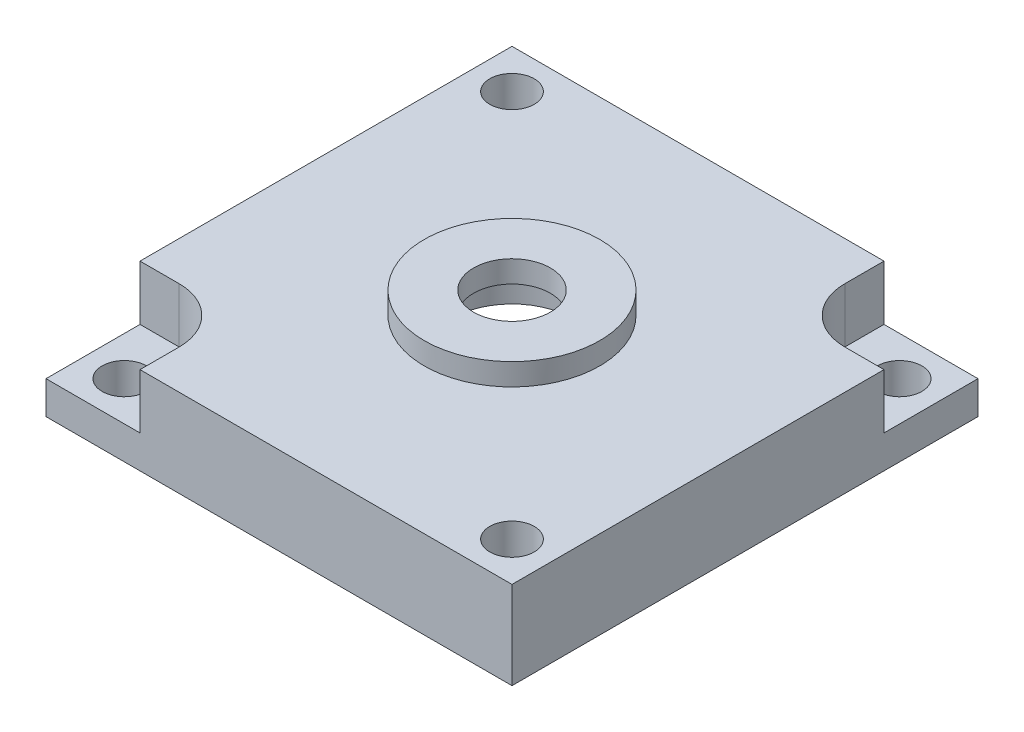
ISO-10303-21;
HEADER;
FILE_DESCRIPTION(('STEP AP214'),'2;1');
FILE_NAME('part.step','',(''),(''),'','','');
FILE_SCHEMA(('AUTOMOTIVE_DESIGN { 1 0 10303 214 1 1 1 1 }'));
ENDSEC;
DATA;
#1=APPLICATION_CONTEXT('core data for automotive mechanical design processes');
#2=APPLICATION_PROTOCOL_DEFINITION('international standard','automotive_design',2000,#1);
#3=PRODUCT_CONTEXT('',#1,'mechanical');
#4=PRODUCT('Part','Part','',(#3));
#5=PRODUCT_RELATED_PRODUCT_CATEGORY('part','',(#4));
#6=PRODUCT_DEFINITION_FORMATION('','',#4);
#7=PRODUCT_DEFINITION_CONTEXT('part definition',#1,'design');
#8=PRODUCT_DEFINITION('design','',#6,#7);
#9=PRODUCT_DEFINITION_SHAPE('','',#8);
#10=(LENGTH_UNIT() NAMED_UNIT(*) SI_UNIT(.MILLI.,.METRE.));
#11=(NAMED_UNIT(*) PLANE_ANGLE_UNIT() SI_UNIT($,.RADIAN.));
#12=(NAMED_UNIT(*) SI_UNIT($,.STERADIAN.) SOLID_ANGLE_UNIT());
#13=UNCERTAINTY_MEASURE_WITH_UNIT(LENGTH_MEASURE(1.E-05),#10,'distance_accuracy_value','');
#14=(GEOMETRIC_REPRESENTATION_CONTEXT(3) GLOBAL_UNCERTAINTY_ASSIGNED_CONTEXT((#13)) GLOBAL_UNIT_ASSIGNED_CONTEXT((#10,
#11,#12)) REPRESENTATION_CONTEXT('',''));
#15=CARTESIAN_POINT('',(0.,0.,0.));
#16=DIRECTION('',(0.,0.,1.));
#17=DIRECTION('',(1.,0.,0.));
#18=AXIS2_PLACEMENT_3D('',#15,#16,#17);
#19=CARTESIAN_POINT('',(17.6776695296637,5.,-17.6776695296637));
#20=DIRECTION('',(0.,-1.,0.));
#21=DIRECTION('',(0.,0.,-1.));
#22=AXIS2_PLACEMENT_3D('',#19,#20,#21);
#23=CYLINDRICAL_SURFACE('',#22,2.025);
#24=CARTESIAN_POINT('',(17.6776695296637,0.,-17.6776695296637));
#25=DIRECTION('',(0.,1.,0.));
#26=DIRECTION('',(0.,0.,1.));
#27=AXIS2_PLACEMENT_3D('',#24,#25,#26);
#28=CIRCLE('',#27,2.025);
#29=CARTESIAN_POINT('',(17.6776695296637,0.,-15.6526695296637));
#30=VERTEX_POINT('',#29);
#31=EDGE_CURVE('E346',#30,#30,#28,.T.);
#32=ORIENTED_EDGE('',*,*,#31,.F.);
#33=EDGE_LOOP('',(#32));
#34=FACE_BOUND('',#33,.T.);
#35=CARTESIAN_POINT('',(17.6776695296637,3.,-17.6776695296637));
#36=DIRECTION('',(0.,1.,0.));
#37=DIRECTION('',(0.,0.,1.));
#38=AXIS2_PLACEMENT_3D('',#35,#36,#37);
#39=CIRCLE('',#38,2.025);
#40=CARTESIAN_POINT('',(17.6776695296637,3.,-15.6526695296637));
#41=VERTEX_POINT('',#40);
#42=EDGE_CURVE('E307',#41,#41,#39,.T.);
#43=ORIENTED_EDGE('',*,*,#42,.T.);
#44=EDGE_LOOP('',(#43));
#45=FACE_BOUND('',#44,.T.);
#46=ADVANCED_FACE('F122',(#34,#45),#23,.F.);
#47=CARTESIAN_POINT('',(-17.6776695296637,5.,17.6776695296637));
#48=DIRECTION('',(0.,-1.,0.));
#49=DIRECTION('',(0.,0.,-1.));
#50=AXIS2_PLACEMENT_3D('',#47,#48,#49);
#51=CYLINDRICAL_SURFACE('',#50,2.025);
#52=CARTESIAN_POINT('',(-17.6776695296637,0.,17.6776695296637));
#53=DIRECTION('',(0.,1.,0.));
#54=DIRECTION('',(0.,0.,1.));
#55=AXIS2_PLACEMENT_3D('',#52,#53,#54);
#56=CIRCLE('',#55,2.025);
#57=CARTESIAN_POINT('',(-17.6776695296637,0.,19.7026695296637));
#58=VERTEX_POINT('',#57);
#59=EDGE_CURVE('E338',#58,#58,#56,.T.);
#60=ORIENTED_EDGE('',*,*,#59,.F.);
#61=EDGE_LOOP('',(#60));
#62=FACE_BOUND('',#61,.T.);
#63=CARTESIAN_POINT('',(-17.6776695296637,3.,17.6776695296637));
#64=DIRECTION('',(0.,1.,0.));
#65=DIRECTION('',(0.,0.,1.));
#66=AXIS2_PLACEMENT_3D('',#63,#64,#65);
#67=CIRCLE('',#66,2.025);
#68=CARTESIAN_POINT('',(-17.6776695296637,3.,19.7026695296637));
#69=VERTEX_POINT('',#68);
#70=EDGE_CURVE('E258',#69,#69,#67,.T.);
#71=ORIENTED_EDGE('',*,*,#70,.T.);
#72=EDGE_LOOP('',(#71));
#73=FACE_BOUND('',#72,.T.);
#74=ADVANCED_FACE('F124',(#62,#73),#51,.F.);
#75=CARTESIAN_POINT('',(0.,5.,21.25));
#76=DIRECTION('',(0.,0.,-1.));
#77=DIRECTION('',(-1.,0.,0.));
#78=AXIS2_PLACEMENT_3D('',#75,#76,#77);
#79=PLANE('',#78);
#80=DIRECTION('',(-1.,0.,0.));
#81=VECTOR('',#80,1.);
#82=CARTESIAN_POINT('',(0.,8.,21.25));
#83=LINE('',#82,#81);
#84=CARTESIAN_POINT('',(21.25,8.,21.25));
#85=VERTEX_POINT('',#84);
#86=CARTESIAN_POINT('',(-12.6776695296637,8.,21.25));
#87=VERTEX_POINT('',#86);
#88=EDGE_CURVE('E324',#85,#87,#83,.T.);
#89=ORIENTED_EDGE('',*,*,#88,.T.);
#90=DIRECTION('',(0.,1.,0.));
#91=VECTOR('',#90,1.);
#92=CARTESIAN_POINT('',(-12.6776695296637,3.,21.25));
#93=LINE('',#92,#91);
#94=CARTESIAN_POINT('',(-12.6776695296637,3.,21.25));
#95=VERTEX_POINT('',#94);
#96=EDGE_CURVE('E259',#95,#87,#93,.T.);
#97=ORIENTED_EDGE('',*,*,#96,.F.);
#98=DIRECTION('',(1.,0.,0.));
#99=VECTOR('',#98,1.);
#100=CARTESIAN_POINT('',(-21.25,3.,21.25));
#101=LINE('',#100,#99);
#102=CARTESIAN_POINT('',(-21.25,3.,21.25));
#103=VERTEX_POINT('',#102);
#104=EDGE_CURVE('E246',#103,#95,#101,.T.);
#105=ORIENTED_EDGE('',*,*,#104,.F.);
#106=DIRECTION('',(0.,-1.,0.));
#107=VECTOR('',#106,1.);
#108=CARTESIAN_POINT('',(-21.25,5.,21.25));
#109=LINE('',#108,#107);
#110=CARTESIAN_POINT('',(-21.25,0.,21.25));
#111=VERTEX_POINT('',#110);
#112=EDGE_CURVE('E374',#103,#111,#109,.T.);
#113=ORIENTED_EDGE('',*,*,#112,.T.);
#114=DIRECTION('',(1.,0.,0.));
#115=VECTOR('',#114,1.);
#116=CARTESIAN_POINT('',(0.,0.,21.25));
#117=LINE('',#116,#115);
#118=CARTESIAN_POINT('',(21.25,0.,21.25));
#119=VERTEX_POINT('',#118);
#120=EDGE_CURVE('E358',#111,#119,#117,.T.);
#121=ORIENTED_EDGE('',*,*,#120,.T.);
#122=DIRECTION('',(0.,-1.,0.));
#123=VECTOR('',#122,1.);
#124=CARTESIAN_POINT('',(21.25,5.,21.25));
#125=LINE('',#124,#123);
#126=EDGE_CURVE('E131',#85,#119,#125,.T.);
#127=ORIENTED_EDGE('',*,*,#126,.F.);
#128=EDGE_LOOP('',(#89,#97,#105,#113,#121,#127));
#129=FACE_BOUND('',#128,.T.);
#130=ADVANCED_FACE('F414',(#129),#79,.F.);
#131=CARTESIAN_POINT('',(21.25,5.,0.));
#132=DIRECTION('',(-1.,0.,0.));
#133=DIRECTION('',(0.,0.,1.));
#134=AXIS2_PLACEMENT_3D('',#131,#132,#133);
#135=PLANE('',#134);
#136=DIRECTION('',(0.,0.,-1.));
#137=VECTOR('',#136,1.);
#138=CARTESIAN_POINT('',(21.25,3.,-12.6776695296637));
#139=LINE('',#138,#137);
#140=CARTESIAN_POINT('',(21.25,3.,-12.6776695296637));
#141=VERTEX_POINT('',#140);
#142=CARTESIAN_POINT('',(21.25,3.,-21.25));
#143=VERTEX_POINT('',#142);
#144=EDGE_CURVE('E294',#141,#143,#139,.T.);
#145=ORIENTED_EDGE('',*,*,#144,.F.);
#146=DIRECTION('',(0.,1.,0.));
#147=VECTOR('',#146,1.);
#148=CARTESIAN_POINT('',(21.25,3.,-12.6776695296637));
#149=LINE('',#148,#147);
#150=CARTESIAN_POINT('',(21.25,8.,-12.6776695296637));
#151=VERTEX_POINT('',#150);
#152=EDGE_CURVE('E268',#141,#151,#149,.T.);
#153=ORIENTED_EDGE('',*,*,#152,.T.);
#154=DIRECTION('',(0.,0.,1.));
#155=VECTOR('',#154,1.);
#156=CARTESIAN_POINT('',(21.25,8.,0.));
#157=LINE('',#156,#155);
#158=EDGE_CURVE('E328',#151,#85,#157,.T.);
#159=ORIENTED_EDGE('',*,*,#158,.T.);
#160=ORIENTED_EDGE('',*,*,#126,.T.);
#161=DIRECTION('',(0.,0.,-1.));
#162=VECTOR('',#161,1.);
#163=CARTESIAN_POINT('',(21.25,0.,0.));
#164=LINE('',#163,#162);
#165=CARTESIAN_POINT('',(21.25,0.,-21.25));
#166=VERTEX_POINT('',#165);
#167=EDGE_CURVE('E362',#119,#166,#164,.T.);
#168=ORIENTED_EDGE('',*,*,#167,.T.);
#169=DIRECTION('',(0.,-1.,0.));
#170=VECTOR('',#169,1.);
#171=CARTESIAN_POINT('',(21.25,5.,-21.25));
#172=LINE('',#171,#170);
#173=EDGE_CURVE('E380',#143,#166,#172,.T.);
#174=ORIENTED_EDGE('',*,*,#173,.F.);
#175=EDGE_LOOP('',(#145,#153,#159,#160,#168,#174));
#176=FACE_BOUND('',#175,.T.);
#177=ADVANCED_FACE('F404',(#176),#135,.F.);
#178=CARTESIAN_POINT('',(0.,5.,-21.25));
#179=DIRECTION('',(0.,0.,-1.));
#180=DIRECTION('',(-1.,0.,0.));
#181=AXIS2_PLACEMENT_3D('',#178,#179,#180);
#182=PLANE('',#181);
#183=DIRECTION('',(0.,1.,0.));
#184=VECTOR('',#183,1.);
#185=CARTESIAN_POINT('',(12.6776695296637,3.,-21.25));
#186=LINE('',#185,#184);
#187=CARTESIAN_POINT('',(12.6776695296637,3.,-21.25));
#188=VERTEX_POINT('',#187);
#189=CARTESIAN_POINT('',(12.6776695296637,8.,-21.25));
#190=VERTEX_POINT('',#189);
#191=EDGE_CURVE('E272',#188,#190,#186,.T.);
#192=ORIENTED_EDGE('',*,*,#191,.F.);
#193=DIRECTION('',(-1.,0.,0.));
#194=VECTOR('',#193,1.);
#195=CARTESIAN_POINT('',(21.25,3.,-21.25));
#196=LINE('',#195,#194);
#197=EDGE_CURVE('E291',#143,#188,#196,.T.);
#198=ORIENTED_EDGE('',*,*,#197,.F.);
#199=ORIENTED_EDGE('',*,*,#173,.T.);
#200=DIRECTION('',(1.,0.,0.));
#201=VECTOR('',#200,1.);
#202=CARTESIAN_POINT('',(0.,0.,-21.25));
#203=LINE('',#202,#201);
#204=CARTESIAN_POINT('',(-21.25,0.,-21.25));
#205=VERTEX_POINT('',#204);
#206=EDGE_CURVE('E366',#205,#166,#203,.T.);
#207=ORIENTED_EDGE('',*,*,#206,.F.);
#208=DIRECTION('',(0.,-1.,0.));
#209=VECTOR('',#208,1.);
#210=CARTESIAN_POINT('',(-21.25,5.,-21.25));
#211=LINE('',#210,#209);
#212=CARTESIAN_POINT('',(-21.25,8.,-21.25));
#213=VERTEX_POINT('',#212);
#214=EDGE_CURVE('E377',#213,#205,#211,.T.);
#215=ORIENTED_EDGE('',*,*,#214,.F.);
#216=DIRECTION('',(-1.,0.,0.));
#217=VECTOR('',#216,1.);
#218=CARTESIAN_POINT('',(0.,8.,-21.25));
#219=LINE('',#218,#217);
#220=EDGE_CURVE('E331',#190,#213,#219,.T.);
#221=ORIENTED_EDGE('',*,*,#220,.F.);
#222=EDGE_LOOP('',(#192,#198,#199,#207,#215,#221));
#223=FACE_BOUND('',#222,.T.);
#224=ADVANCED_FACE('F424',(#223),#182,.T.);
#225=CARTESIAN_POINT('',(0.,5.,0.));
#226=DIRECTION('',(0.,-1.,0.));
#227=DIRECTION('',(0.,0.,-1.));
#228=AXIS2_PLACEMENT_3D('',#225,#226,#227);
#229=CYLINDRICAL_SURFACE('',#228,18.5);
#230=CARTESIAN_POINT('',(0.,5.,0.));
#231=DIRECTION('',(0.,1.,0.));
#232=DIRECTION('',(0.,0.,1.));
#233=AXIS2_PLACEMENT_3D('',#230,#231,#232);
#234=CIRCLE('',#233,18.5);
#235=CARTESIAN_POINT('',(0.,5.,18.5));
#236=VERTEX_POINT('',#235);
#237=EDGE_CURVE('E334',#236,#236,#234,.T.);
#238=ORIENTED_EDGE('',*,*,#237,.T.);
#239=EDGE_LOOP('',(#238));
#240=FACE_BOUND('',#239,.T.);
#241=CARTESIAN_POINT('',(0.,0.,0.));
#242=DIRECTION('',(0.,1.,0.));
#243=DIRECTION('',(0.,0.,1.));
#244=AXIS2_PLACEMENT_3D('',#241,#242,#243);
#245=CIRCLE('',#244,18.5);
#246=CARTESIAN_POINT('',(0.,0.,18.5));
#247=VERTEX_POINT('',#246);
#248=EDGE_CURVE('E354',#247,#247,#245,.T.);
#249=ORIENTED_EDGE('',*,*,#248,.F.);
#250=EDGE_LOOP('',(#249));
#251=FACE_BOUND('',#250,.T.);
#252=ADVANCED_FACE('F466',(#240,#251),#229,.F.);
#253=CARTESIAN_POINT('',(-17.6776695296637,5.,-17.6776695296637));
#254=DIRECTION('',(0.,-1.,0.));
#255=DIRECTION('',(0.,0.,-1.));
#256=AXIS2_PLACEMENT_3D('',#253,#254,#255);
#257=CYLINDRICAL_SURFACE('',#256,2.025);
#258=CARTESIAN_POINT('',(-17.6776695296637,0.,-17.6776695296637));
#259=DIRECTION('',(0.,1.,0.));
#260=DIRECTION('',(0.,0.,1.));
#261=AXIS2_PLACEMENT_3D('',#258,#259,#260);
#262=CIRCLE('',#261,2.025);
#263=CARTESIAN_POINT('',(-17.6776695296637,0.,-15.6526695296637));
#264=VERTEX_POINT('',#263);
#265=EDGE_CURVE('E350',#264,#264,#262,.T.);
#266=ORIENTED_EDGE('',*,*,#265,.F.);
#267=EDGE_LOOP('',(#266));
#268=FACE_BOUND('',#267,.T.);
#269=CARTESIAN_POINT('',(-17.6776695296637,8.,-17.6776695296637));
#270=DIRECTION('',(0.,1.,0.));
#271=DIRECTION('',(0.,0.,1.));
#272=AXIS2_PLACEMENT_3D('',#269,#270,#271);
#273=CIRCLE('',#272,2.025);
#274=CARTESIAN_POINT('',(-17.6776695296637,8.,-15.6526695296637));
#275=VERTEX_POINT('',#274);
#276=EDGE_CURVE('E312',#275,#275,#273,.T.);
#277=ORIENTED_EDGE('',*,*,#276,.T.);
#278=EDGE_LOOP('',(#277));
#279=FACE_BOUND('',#278,.T.);
#280=ADVANCED_FACE('F455',(#268,#279),#257,.F.);
#281=CARTESIAN_POINT('',(17.6776695296637,5.,17.6776695296637));
#282=DIRECTION('',(0.,-1.,0.));
#283=DIRECTION('',(0.,0.,-1.));
#284=AXIS2_PLACEMENT_3D('',#281,#282,#283);
#285=CYLINDRICAL_SURFACE('',#284,2.025);
#286=CARTESIAN_POINT('',(17.6776695296637,0.,17.6776695296637));
#287=DIRECTION('',(0.,1.,0.));
#288=DIRECTION('',(0.,0.,1.));
#289=AXIS2_PLACEMENT_3D('',#286,#287,#288);
#290=CIRCLE('',#289,2.025);
#291=CARTESIAN_POINT('',(17.6776695296637,0.,19.7026695296637));
#292=VERTEX_POINT('',#291);
#293=EDGE_CURVE('E342',#292,#292,#290,.T.);
#294=ORIENTED_EDGE('',*,*,#293,.F.);
#295=EDGE_LOOP('',(#294));
#296=FACE_BOUND('',#295,.T.);
#297=CARTESIAN_POINT('',(17.6776695296637,8.,17.6776695296637));
#298=DIRECTION('',(0.,1.,0.));
#299=DIRECTION('',(0.,0.,1.));
#300=AXIS2_PLACEMENT_3D('',#297,#298,#299);
#301=CIRCLE('',#300,2.025);
#302=CARTESIAN_POINT('',(17.6776695296637,8.,19.7026695296637));
#303=VERTEX_POINT('',#302);
#304=EDGE_CURVE('E308',#303,#303,#301,.T.);
#305=ORIENTED_EDGE('',*,*,#304,.T.);
#306=EDGE_LOOP('',(#305));
#307=FACE_BOUND('',#306,.T.);
#308=ADVANCED_FACE('F457',(#296,#307),#285,.F.);
#309=CARTESIAN_POINT('',(-21.25,5.,0.));
#310=DIRECTION('',(-1.,0.,0.));
#311=DIRECTION('',(0.,0.,1.));
#312=AXIS2_PLACEMENT_3D('',#309,#310,#311);
#313=PLANE('',#312);
#314=DIRECTION('',(0.,1.,0.));
#315=VECTOR('',#314,1.);
#316=CARTESIAN_POINT('',(-21.25,3.,12.6776695296637));
#317=LINE('',#316,#315);
#318=CARTESIAN_POINT('',(-21.25,3.,12.6776695296637));
#319=VERTEX_POINT('',#318);
#320=CARTESIAN_POINT('',(-21.25,8.,12.6776695296637));
#321=VERTEX_POINT('',#320);
#322=EDGE_CURVE('E219',#319,#321,#317,.T.);
#323=ORIENTED_EDGE('',*,*,#322,.T.);
#324=DIRECTION('',(0.,0.,1.));
#325=VECTOR('',#324,1.);
#326=CARTESIAN_POINT('',(-21.25,8.,0.));
#327=LINE('',#326,#325);
#328=EDGE_CURVE('E320',#213,#321,#327,.T.);
#329=ORIENTED_EDGE('',*,*,#328,.F.);
#330=ORIENTED_EDGE('',*,*,#214,.T.);
#331=DIRECTION('',(0.,0.,-1.));
#332=VECTOR('',#331,1.);
#333=CARTESIAN_POINT('',(-21.25,0.,0.));
#334=LINE('',#333,#332);
#335=EDGE_CURVE('E370',#111,#205,#334,.T.);
#336=ORIENTED_EDGE('',*,*,#335,.F.);
#337=ORIENTED_EDGE('',*,*,#112,.F.);
#338=DIRECTION('',(0.,0.,1.));
#339=VECTOR('',#338,1.);
#340=CARTESIAN_POINT('',(-21.25,3.,12.6776695296637));
#341=LINE('',#340,#339);
#342=EDGE_CURVE('E229',#319,#103,#341,.T.);
#343=ORIENTED_EDGE('',*,*,#342,.F.);
#344=EDGE_LOOP('',(#323,#329,#330,#336,#337,#343));
#345=FACE_BOUND('',#344,.T.);
#346=ADVANCED_FACE('F432',(#345),#313,.T.);
#347=CARTESIAN_POINT('',(0.,0.,0.));
#348=DIRECTION('',(0.,1.,0.));
#349=DIRECTION('',(0.,0.,1.));
#350=AXIS2_PLACEMENT_3D('',#347,#348,#349);
#351=PLANE('',#350);
#352=ORIENTED_EDGE('',*,*,#59,.T.);
#353=EDGE_LOOP('',(#352));
#354=FACE_BOUND('',#353,.T.);
#355=ORIENTED_EDGE('',*,*,#293,.T.);
#356=EDGE_LOOP('',(#355));
#357=FACE_BOUND('',#356,.T.);
#358=ORIENTED_EDGE('',*,*,#31,.T.);
#359=EDGE_LOOP('',(#358));
#360=FACE_BOUND('',#359,.T.);
#361=ORIENTED_EDGE('',*,*,#265,.T.);
#362=EDGE_LOOP('',(#361));
#363=FACE_BOUND('',#362,.T.);
#364=ORIENTED_EDGE('',*,*,#248,.T.);
#365=EDGE_LOOP('',(#364));
#366=FACE_BOUND('',#365,.T.);
#367=ORIENTED_EDGE('',*,*,#120,.F.);
#368=ORIENTED_EDGE('',*,*,#335,.T.);
#369=ORIENTED_EDGE('',*,*,#206,.T.);
#370=ORIENTED_EDGE('',*,*,#167,.F.);
#371=EDGE_LOOP('',(#367,#368,#369,#370));
#372=FACE_BOUND('',#371,.T.);
#373=ADVANCED_FACE('F419',(#354,#357,#360,#363,#366,#372),#351,.F.);
#374=CARTESIAN_POINT('',(0.,5.,0.));
#375=DIRECTION('',(0.,-1.,0.));
#376=DIRECTION('',(0.,0.,-1.));
#377=AXIS2_PLACEMENT_3D('',#374,#375,#376);
#378=PLANE('',#377);
#379=CARTESIAN_POINT('',(0.,5.,0.));
#380=DIRECTION('',(0.,1.,0.));
#381=DIRECTION('',(0.,0.,1.));
#382=AXIS2_PLACEMENT_3D('',#379,#380,#381);
#383=CIRCLE('',#382,5.515);
#384=CARTESIAN_POINT('',(0.,5.,5.515));
#385=VERTEX_POINT('',#384);
#386=EDGE_CURVE('E316',#385,#385,#383,.T.);
#387=ORIENTED_EDGE('',*,*,#386,.T.);
#388=EDGE_LOOP('',(#387));
#389=FACE_BOUND('',#388,.T.);
#390=ORIENTED_EDGE('',*,*,#237,.F.);
#391=EDGE_LOOP('',(#390));
#392=FACE_BOUND('',#391,.T.);
#393=ADVANCED_FACE('F474',(#389,#392),#378,.T.);
#394=CARTESIAN_POINT('',(0.,8.,0.));
#395=DIRECTION('',(0.,-1.,0.));
#396=DIRECTION('',(0.,0.,-1.));
#397=AXIS2_PLACEMENT_3D('',#394,#395,#396);
#398=PLANE('',#397);
#399=CARTESIAN_POINT('',(0.,8.,0.));
#400=DIRECTION('',(0.,-1.,0.));
#401=DIRECTION('',(0.,0.,-1.));
#402=AXIS2_PLACEMENT_3D('',#399,#400,#401);
#403=CIRCLE('',#402,8.);
#404=CARTESIAN_POINT('',(0.,8.,-8.));
#405=VERTEX_POINT('',#404);
#406=EDGE_CURVE('E12',#405,#405,#403,.F.);
#407=ORIENTED_EDGE('',*,*,#406,.F.);
#408=EDGE_LOOP('',(#407));
#409=FACE_BOUND('',#408,.T.);
#410=CARTESIAN_POINT('',(-17.6776695296637,8.,17.6776695296637));
#411=DIRECTION('',(0.,1.,0.));
#412=DIRECTION('',(0.,0.,1.));
#413=AXIS2_PLACEMENT_3D('',#410,#411,#412);
#414=CIRCLE('',#413,5.);
#415=CARTESIAN_POINT('',(-12.6776695296637,8.,17.6776695296637));
#416=VERTEX_POINT('',#415);
#417=CARTESIAN_POINT('',(-17.6776695296637,8.,12.6776695296637));
#418=VERTEX_POINT('',#417);
#419=EDGE_CURVE('E138',#416,#418,#414,.T.);
#420=ORIENTED_EDGE('',*,*,#419,.F.);
#421=DIRECTION('',(0.,0.,-1.));
#422=VECTOR('',#421,1.);
#423=CARTESIAN_POINT('',(-12.6776695296637,8.,17.6776695296637));
#424=LINE('',#423,#422);
#425=EDGE_CURVE('E234',#87,#416,#424,.T.);
#426=ORIENTED_EDGE('',*,*,#425,.F.);
#427=ORIENTED_EDGE('',*,*,#88,.F.);
#428=ORIENTED_EDGE('',*,*,#158,.F.);
#429=DIRECTION('',(1.,0.,0.));
#430=VECTOR('',#429,1.);
#431=CARTESIAN_POINT('',(17.6776695296637,8.,-12.6776695296637));
#432=LINE('',#431,#430);
#433=CARTESIAN_POINT('',(17.6776695296637,8.,-12.6776695296637));
#434=VERTEX_POINT('',#433);
#435=EDGE_CURVE('E282',#434,#151,#432,.T.);
#436=ORIENTED_EDGE('',*,*,#435,.F.);
#437=CARTESIAN_POINT('',(17.6776695296637,8.,-17.6776695296637));
#438=DIRECTION('',(0.,1.,0.));
#439=DIRECTION('',(0.,0.,1.));
#440=AXIS2_PLACEMENT_3D('',#437,#438,#439);
#441=CIRCLE('',#440,5.);
#442=CARTESIAN_POINT('',(12.6776695296637,8.,-17.6776695296637));
#443=VERTEX_POINT('',#442);
#444=EDGE_CURVE('E146',#443,#434,#441,.T.);
#445=ORIENTED_EDGE('',*,*,#444,.F.);
#446=DIRECTION('',(0.,0.,1.));
#447=VECTOR('',#446,1.);
#448=CARTESIAN_POINT('',(12.6776695296637,8.,-17.6776695296637));
#449=LINE('',#448,#447);
#450=EDGE_CURVE('E278',#190,#443,#449,.T.);
#451=ORIENTED_EDGE('',*,*,#450,.F.);
#452=ORIENTED_EDGE('',*,*,#220,.T.);
#453=ORIENTED_EDGE('',*,*,#328,.T.);
#454=DIRECTION('',(-1.,0.,0.));
#455=VECTOR('',#454,1.);
#456=CARTESIAN_POINT('',(-17.6776695296637,8.,12.6776695296637));
#457=LINE('',#456,#455);
#458=EDGE_CURVE('E238',#418,#321,#457,.T.);
#459=ORIENTED_EDGE('',*,*,#458,.F.);
#460=EDGE_LOOP('',(#420,#426,#427,#428,#436,#445,#451,#452,#453,#459));
#461=FACE_BOUND('',#460,.T.);
#462=ORIENTED_EDGE('',*,*,#276,.F.);
#463=EDGE_LOOP('',(#462));
#464=FACE_BOUND('',#463,.T.);
#465=ORIENTED_EDGE('',*,*,#304,.F.);
#466=EDGE_LOOP('',(#465));
#467=FACE_BOUND('',#466,.T.);
#468=ADVANCED_FACE('F409',(#409,#461,#464,#467),#398,.F.);
#469=CARTESIAN_POINT('',(0.,8.,0.));
#470=DIRECTION('',(0.,-1.,0.));
#471=DIRECTION('',(0.,0.,-1.));
#472=AXIS2_PLACEMENT_3D('',#469,#470,#471);
#473=CYLINDRICAL_SURFACE('',#472,5.515);
#474=CARTESIAN_POINT('',(0.,8.,0.));
#475=DIRECTION('',(0.,1.,0.));
#476=DIRECTION('',(0.,0.,1.));
#477=AXIS2_PLACEMENT_3D('',#474,#475,#476);
#478=CIRCLE('',#477,5.515);
#479=CARTESIAN_POINT('',(0.,8.,5.515));
#480=VERTEX_POINT('',#479);
#481=EDGE_CURVE('E241',#480,#480,#478,.T.);
#482=ORIENTED_EDGE('',*,*,#481,.T.);
#483=EDGE_LOOP('',(#482));
#484=FACE_BOUND('',#483,.T.);
#485=ORIENTED_EDGE('',*,*,#386,.F.);
#486=EDGE_LOOP('',(#485));
#487=FACE_BOUND('',#486,.T.);
#488=ADVANCED_FACE('F473',(#484,#487),#473,.F.);
#489=CARTESIAN_POINT('',(17.6776695296637,3.,-17.6776695296637));
#490=DIRECTION('',(0.,1.,0.));
#491=DIRECTION('',(0.,0.,1.));
#492=AXIS2_PLACEMENT_3D('',#489,#490,#491);
#493=CYLINDRICAL_SURFACE('',#492,5.);
#494=ORIENTED_EDGE('',*,*,#444,.T.);
#495=DIRECTION('',(0.,1.,0.));
#496=VECTOR('',#495,1.);
#497=CARTESIAN_POINT('',(17.6776695296637,3.,-12.6776695296637));
#498=LINE('',#497,#496);
#499=CARTESIAN_POINT('',(17.6776695296637,3.,-12.6776695296637));
#500=VERTEX_POINT('',#499);
#501=EDGE_CURVE('E264',#500,#434,#498,.T.);
#502=ORIENTED_EDGE('',*,*,#501,.F.);
#503=CARTESIAN_POINT('',(17.6776695296637,3.,-17.6776695296637));
#504=DIRECTION('',(0.,1.,0.));
#505=DIRECTION('',(0.,0.,1.));
#506=AXIS2_PLACEMENT_3D('',#503,#504,#505);
#507=CIRCLE('',#506,5.);
#508=CARTESIAN_POINT('',(12.6776695296637,3.,-17.6776695296637));
#509=VERTEX_POINT('',#508);
#510=EDGE_CURVE('E283',#509,#500,#507,.T.);
#511=ORIENTED_EDGE('',*,*,#510,.F.);
#512=DIRECTION('',(0.,1.,0.));
#513=VECTOR('',#512,1.);
#514=CARTESIAN_POINT('',(12.6776695296637,3.,-17.6776695296637));
#515=LINE('',#514,#513);
#516=EDGE_CURVE('E275',#509,#443,#515,.T.);
#517=ORIENTED_EDGE('',*,*,#516,.T.);
#518=EDGE_LOOP('',(#494,#502,#511,#517));
#519=FACE_BOUND('',#518,.T.);
#520=ADVANCED_FACE('F399',(#519),#493,.F.);
#521=CARTESIAN_POINT('',(12.6776695296637,3.,-17.6776695296637));
#522=DIRECTION('',(-1.,0.,0.));
#523=DIRECTION('',(0.,0.,1.));
#524=AXIS2_PLACEMENT_3D('',#521,#522,#523);
#525=PLANE('',#524);
#526=ORIENTED_EDGE('',*,*,#450,.T.);
#527=ORIENTED_EDGE('',*,*,#516,.F.);
#528=DIRECTION('',(0.,0.,1.));
#529=VECTOR('',#528,1.);
#530=CARTESIAN_POINT('',(12.6776695296637,3.,-17.6776695296637));
#531=LINE('',#530,#529);
#532=EDGE_CURVE('E267',#188,#509,#531,.T.);
#533=ORIENTED_EDGE('',*,*,#532,.F.);
#534=ORIENTED_EDGE('',*,*,#191,.T.);
#535=EDGE_LOOP('',(#526,#527,#533,#534));
#536=FACE_BOUND('',#535,.T.);
#537=ADVANCED_FACE('F429',(#536),#525,.F.);
#538=CARTESIAN_POINT('',(17.6776695296637,3.,-12.6776695296637));
#539=DIRECTION('',(0.,0.,1.));
#540=DIRECTION('',(1.,0.,0.));
#541=AXIS2_PLACEMENT_3D('',#538,#539,#540);
#542=PLANE('',#541);
#543=ORIENTED_EDGE('',*,*,#435,.T.);
#544=ORIENTED_EDGE('',*,*,#152,.F.);
#545=DIRECTION('',(1.,0.,0.));
#546=VECTOR('',#545,1.);
#547=CARTESIAN_POINT('',(17.6776695296637,3.,-12.6776695296637));
#548=LINE('',#547,#546);
#549=EDGE_CURVE('E297',#500,#141,#548,.T.);
#550=ORIENTED_EDGE('',*,*,#549,.F.);
#551=ORIENTED_EDGE('',*,*,#501,.T.);
#552=EDGE_LOOP('',(#543,#544,#550,#551));
#553=FACE_BOUND('',#552,.T.);
#554=ADVANCED_FACE('F393',(#553),#542,.F.);
#555=CARTESIAN_POINT('',(17.6776695296637,3.,-17.6776695296637));
#556=DIRECTION('',(0.,1.,0.));
#557=DIRECTION('',(0.,0.,1.));
#558=AXIS2_PLACEMENT_3D('',#555,#556,#557);
#559=PLANE('',#558);
#560=ORIENTED_EDGE('',*,*,#42,.F.);
#561=EDGE_LOOP('',(#560));
#562=FACE_BOUND('',#561,.T.);
#563=ORIENTED_EDGE('',*,*,#510,.T.);
#564=ORIENTED_EDGE('',*,*,#549,.T.);
#565=ORIENTED_EDGE('',*,*,#144,.T.);
#566=ORIENTED_EDGE('',*,*,#197,.T.);
#567=ORIENTED_EDGE('',*,*,#532,.T.);
#568=EDGE_LOOP('',(#563,#564,#565,#566,#567));
#569=FACE_BOUND('',#568,.T.);
#570=ADVANCED_FACE('F390',(#562,#569),#559,.T.);
#571=CARTESIAN_POINT('',(-17.6776695296637,3.,17.6776695296637));
#572=DIRECTION('',(0.,1.,0.));
#573=DIRECTION('',(0.,0.,1.));
#574=AXIS2_PLACEMENT_3D('',#571,#572,#573);
#575=CYLINDRICAL_SURFACE('',#574,5.);
#576=ORIENTED_EDGE('',*,*,#419,.T.);
#577=DIRECTION('',(0.,1.,0.));
#578=VECTOR('',#577,1.);
#579=CARTESIAN_POINT('',(-17.6776695296637,3.,12.6776695296637));
#580=LINE('',#579,#578);
#581=CARTESIAN_POINT('',(-17.6776695296637,3.,12.6776695296637));
#582=VERTEX_POINT('',#581);
#583=EDGE_CURVE('E210',#582,#418,#580,.T.);
#584=ORIENTED_EDGE('',*,*,#583,.F.);
#585=CARTESIAN_POINT('',(-17.6776695296637,3.,17.6776695296637));
#586=DIRECTION('',(0.,1.,0.));
#587=DIRECTION('',(0.,0.,1.));
#588=AXIS2_PLACEMENT_3D('',#585,#586,#587);
#589=CIRCLE('',#588,5.);
#590=CARTESIAN_POINT('',(-12.6776695296637,3.,17.6776695296637));
#591=VERTEX_POINT('',#590);
#592=EDGE_CURVE('E214',#591,#582,#589,.T.);
#593=ORIENTED_EDGE('',*,*,#592,.F.);
#594=DIRECTION('',(0.,1.,0.));
#595=VECTOR('',#594,1.);
#596=CARTESIAN_POINT('',(-12.6776695296637,3.,17.6776695296637));
#597=LINE('',#596,#595);
#598=EDGE_CURVE('E255',#591,#416,#597,.T.);
#599=ORIENTED_EDGE('',*,*,#598,.T.);
#600=EDGE_LOOP('',(#576,#584,#593,#599));
#601=FACE_BOUND('',#600,.T.);
#602=ADVANCED_FACE('F212',(#601),#575,.F.);
#603=CARTESIAN_POINT('',(-12.6776695296637,3.,17.6776695296637));
#604=DIRECTION('',(1.,0.,0.));
#605=DIRECTION('',(0.,0.,-1.));
#606=AXIS2_PLACEMENT_3D('',#603,#604,#605);
#607=PLANE('',#606);
#608=ORIENTED_EDGE('',*,*,#425,.T.);
#609=ORIENTED_EDGE('',*,*,#598,.F.);
#610=DIRECTION('',(0.,0.,-1.));
#611=VECTOR('',#610,1.);
#612=CARTESIAN_POINT('',(-12.6776695296637,3.,17.6776695296637));
#613=LINE('',#612,#611);
#614=EDGE_CURVE('E220',#95,#591,#613,.T.);
#615=ORIENTED_EDGE('',*,*,#614,.F.);
#616=ORIENTED_EDGE('',*,*,#96,.T.);
#617=EDGE_LOOP('',(#608,#609,#615,#616));
#618=FACE_BOUND('',#617,.T.);
#619=ADVANCED_FACE('F435',(#618),#607,.F.);
#620=CARTESIAN_POINT('',(-17.6776695296637,3.,12.6776695296637));
#621=DIRECTION('',(0.,0.,-1.));
#622=DIRECTION('',(-1.,0.,0.));
#623=AXIS2_PLACEMENT_3D('',#620,#621,#622);
#624=PLANE('',#623);
#625=ORIENTED_EDGE('',*,*,#458,.T.);
#626=ORIENTED_EDGE('',*,*,#322,.F.);
#627=DIRECTION('',(-1.,0.,0.));
#628=VECTOR('',#627,1.);
#629=CARTESIAN_POINT('',(-17.6776695296637,3.,12.6776695296637));
#630=LINE('',#629,#628);
#631=EDGE_CURVE('E223',#582,#319,#630,.T.);
#632=ORIENTED_EDGE('',*,*,#631,.F.);
#633=ORIENTED_EDGE('',*,*,#583,.T.);
#634=EDGE_LOOP('',(#625,#626,#632,#633));
#635=FACE_BOUND('',#634,.T.);
#636=ADVANCED_FACE('F224',(#635),#624,.F.);
#637=CARTESIAN_POINT('',(-17.6776695296637,3.,17.6776695296637));
#638=DIRECTION('',(0.,1.,0.));
#639=DIRECTION('',(0.,0.,1.));
#640=AXIS2_PLACEMENT_3D('',#637,#638,#639);
#641=PLANE('',#640);
#642=ORIENTED_EDGE('',*,*,#70,.F.);
#643=EDGE_LOOP('',(#642));
#644=FACE_BOUND('',#643,.T.);
#645=ORIENTED_EDGE('',*,*,#592,.T.);
#646=ORIENTED_EDGE('',*,*,#631,.T.);
#647=ORIENTED_EDGE('',*,*,#342,.T.);
#648=ORIENTED_EDGE('',*,*,#104,.T.);
#649=ORIENTED_EDGE('',*,*,#614,.T.);
#650=EDGE_LOOP('',(#645,#646,#647,#648,#649));
#651=FACE_BOUND('',#650,.T.);
#652=ADVANCED_FACE('F231',(#644,#651),#641,.T.);
#653=CARTESIAN_POINT('',(0.,8.,0.));
#654=DIRECTION('',(0.,1.,0.));
#655=DIRECTION('',(0.,0.,1.));
#656=AXIS2_PLACEMENT_3D('',#653,#654,#655);
#657=PLANE('',#656);
#658=CARTESIAN_POINT('',(0.,8.,0.));
#659=DIRECTION('',(0.,1.,0.));
#660=DIRECTION('',(0.,0.,1.));
#661=AXIS2_PLACEMENT_3D('',#658,#659,#660);
#662=CIRCLE('',#661,3.5);
#663=CARTESIAN_POINT('',(0.,8.,3.5));
#664=VERTEX_POINT('',#663);
#665=EDGE_CURVE('E675',#664,#664,#662,.T.);
#666=ORIENTED_EDGE('',*,*,#665,.T.);
#667=EDGE_LOOP('',(#666));
#668=FACE_BOUND('',#667,.T.);
#669=ORIENTED_EDGE('',*,*,#481,.F.);
#670=EDGE_LOOP('',(#669));
#671=FACE_BOUND('',#670,.T.);
#672=ADVANCED_FACE('F628',(#668,#671),#657,.F.);
#673=CARTESIAN_POINT('',(0.,10.,0.));
#674=DIRECTION('',(0.,1.,0.));
#675=DIRECTION('',(0.,0.,1.));
#676=AXIS2_PLACEMENT_3D('',#673,#674,#675);
#677=PLANE('',#676);
#678=CARTESIAN_POINT('',(0.,10.,0.));
#679=DIRECTION('',(0.,1.,0.));
#680=DIRECTION('',(0.,0.,1.));
#681=AXIS2_PLACEMENT_3D('',#678,#679,#680);
#682=CIRCLE('',#681,8.);
#683=CARTESIAN_POINT('',(0.,10.,8.));
#684=VERTEX_POINT('',#683);
#685=EDGE_CURVE('E679',#684,#684,#682,.T.);
#686=ORIENTED_EDGE('',*,*,#685,.T.);
#687=EDGE_LOOP('',(#686));
#688=FACE_BOUND('',#687,.T.);
#689=CARTESIAN_POINT('',(0.,10.,0.));
#690=DIRECTION('',(0.,1.,0.));
#691=DIRECTION('',(0.,0.,1.));
#692=AXIS2_PLACEMENT_3D('',#689,#690,#691);
#693=CIRCLE('',#692,3.5);
#694=CARTESIAN_POINT('',(0.,10.,3.5));
#695=VERTEX_POINT('',#694);
#696=EDGE_CURVE('E672',#695,#695,#693,.T.);
#697=ORIENTED_EDGE('',*,*,#696,.F.);
#698=EDGE_LOOP('',(#697));
#699=FACE_BOUND('',#698,.T.);
#700=ADVANCED_FACE('F636',(#688,#699),#677,.T.);
#701=CARTESIAN_POINT('',(0.,10.,0.));
#702=DIRECTION('',(0.,-1.,0.));
#703=DIRECTION('',(0.,0.,-1.));
#704=AXIS2_PLACEMENT_3D('',#701,#702,#703);
#705=CYLINDRICAL_SURFACE('',#704,8.);
#706=ORIENTED_EDGE('',*,*,#685,.F.);
#707=EDGE_LOOP('',(#706));
#708=FACE_BOUND('',#707,.T.);
#709=ORIENTED_EDGE('',*,*,#406,.T.);
#710=EDGE_LOOP('',(#709));
#711=FACE_BOUND('',#710,.T.);
#712=ADVANCED_FACE('F646',(#708,#711),#705,.T.);
#713=CARTESIAN_POINT('',(0.,10.,0.));
#714=DIRECTION('',(0.,-1.,0.));
#715=DIRECTION('',(0.,0.,-1.));
#716=AXIS2_PLACEMENT_3D('',#713,#714,#715);
#717=CYLINDRICAL_SURFACE('',#716,3.5);
#718=ORIENTED_EDGE('',*,*,#696,.T.);
#719=EDGE_LOOP('',(#718));
#720=FACE_BOUND('',#719,.T.);
#721=ORIENTED_EDGE('',*,*,#665,.F.);
#722=EDGE_LOOP('',(#721));
#723=FACE_BOUND('',#722,.T.);
#724=ADVANCED_FACE('F656',(#720,#723),#717,.F.);
#725=CLOSED_SHELL('',(#46,#74,#130,#177,#224,#252,#280,#308,#346,#373,#393,#468,#488,#520,#537,
#554,#570,#602,#619,#636,#652,#672,#700,#712,#724));
#726=MANIFOLD_SOLID_BREP('B2',#725);
#727=ADVANCED_BREP_SHAPE_REPRESENTATION('',(#18,#726),#14);
#728=SHAPE_DEFINITION_REPRESENTATION(#9,#727);
ENDSEC;
END-ISO-10303-21;
